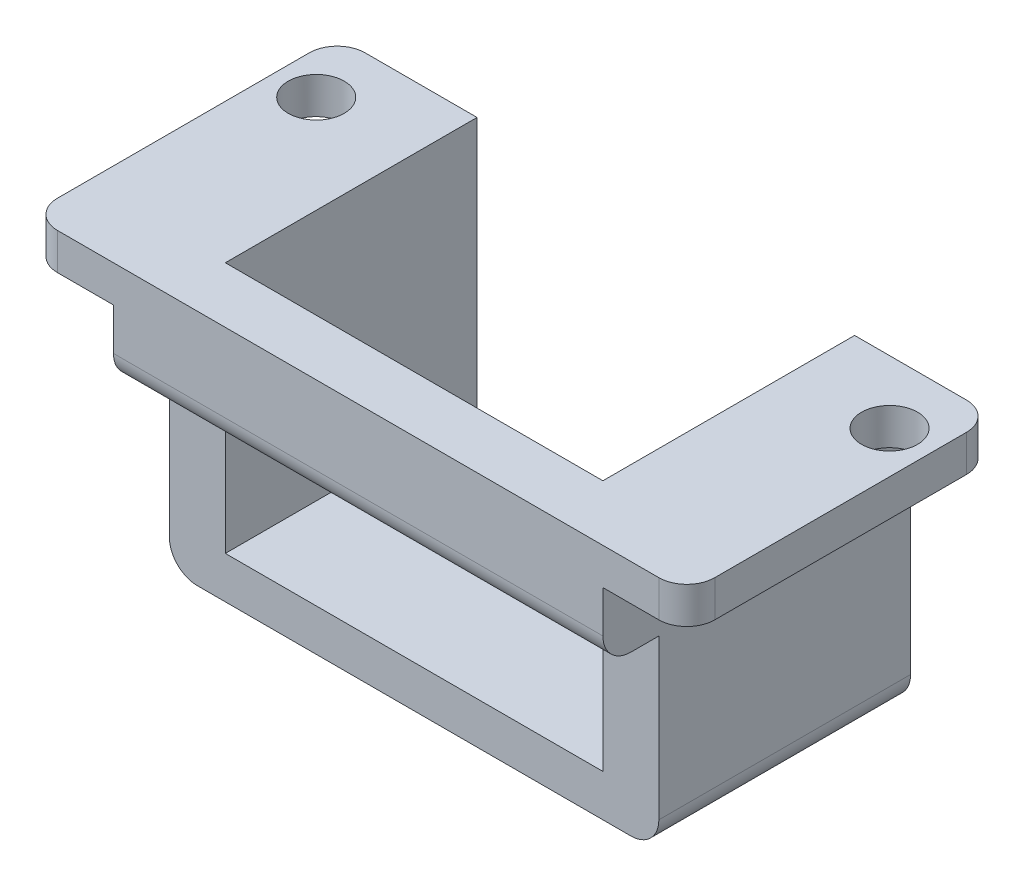
ISO-10303-21;
HEADER;
FILE_DESCRIPTION(('STEP AP214'),'2;1');
FILE_NAME('part.step','',(''),(''),'','','');
FILE_SCHEMA(('AUTOMOTIVE_DESIGN { 1 0 10303 214 1 1 1 1 }'));
ENDSEC;
DATA;
#1=APPLICATION_CONTEXT('core data for automotive mechanical design processes');
#2=APPLICATION_PROTOCOL_DEFINITION('international standard','automotive_design',2000,#1);
#3=PRODUCT_CONTEXT('',#1,'mechanical');
#4=PRODUCT('Part','Part','',(#3));
#5=PRODUCT_RELATED_PRODUCT_CATEGORY('part','',(#4));
#6=PRODUCT_DEFINITION_FORMATION('','',#4);
#7=PRODUCT_DEFINITION_CONTEXT('part definition',#1,'design');
#8=PRODUCT_DEFINITION('design','',#6,#7);
#9=PRODUCT_DEFINITION_SHAPE('','',#8);
#10=(LENGTH_UNIT() NAMED_UNIT(*) SI_UNIT(.MILLI.,.METRE.));
#11=(NAMED_UNIT(*) PLANE_ANGLE_UNIT() SI_UNIT($,.RADIAN.));
#12=(NAMED_UNIT(*) SI_UNIT($,.STERADIAN.) SOLID_ANGLE_UNIT());
#13=UNCERTAINTY_MEASURE_WITH_UNIT(LENGTH_MEASURE(1.E-05),#10,'distance_accuracy_value','');
#14=(GEOMETRIC_REPRESENTATION_CONTEXT(3) GLOBAL_UNCERTAINTY_ASSIGNED_CONTEXT((#13)) GLOBAL_UNIT_ASSIGNED_CONTEXT((#10,
#11,#12)) REPRESENTATION_CONTEXT('',''));
#15=CARTESIAN_POINT('',(0.,0.,0.));
#16=DIRECTION('',(0.,0.,1.));
#17=DIRECTION('',(1.,0.,0.));
#18=AXIS2_PLACEMENT_3D('',#15,#16,#17);
#19=CARTESIAN_POINT('',(47.,-2.61445670320697,9.));
#20=DIRECTION('',(0.,1.,0.));
#21=DIRECTION('',(0.,0.,1.));
#22=AXIS2_PLACEMENT_3D('',#19,#20,#21);
#23=PLANE('',#22);
#24=CARTESIAN_POINT('',(44.,-2.61445670320698,4.5));
#25=DIRECTION('',(0.,1.,0.));
#26=DIRECTION('',(-1.,0.,0.));
#27=AXIS2_PLACEMENT_3D('',#24,#25,#26);
#28=CIRCLE('',#27,2.);
#29=CARTESIAN_POINT('',(42.,-2.61445670320698,4.5));
#30=VERTEX_POINT('',#29);
#31=EDGE_CURVE('E228',#30,#30,#28,.T.);
#32=ORIENTED_EDGE('',*,*,#31,.T.);
#33=EDGE_LOOP('',(#32));
#34=FACE_BOUND('',#33,.T.);
#35=DIRECTION('',(1.,0.,0.));
#36=VECTOR('',#35,1.);
#37=CARTESIAN_POINT('',(0.,-2.61445670320697,22.));
#38=LINE('',#37,#36);
#39=CARTESIAN_POINT('',(41.,-2.61445670320697,22.));
#40=VERTEX_POINT('',#39);
#41=CARTESIAN_POINT('',(45.,-2.61445670320697,22.));
#42=VERTEX_POINT('',#41);
#43=EDGE_CURVE('E363',#40,#42,#38,.T.);
#44=ORIENTED_EDGE('',*,*,#43,.F.);
#45=DIRECTION('',(0.,0.,-1.));
#46=VECTOR('',#45,1.);
#47=CARTESIAN_POINT('',(41.,-2.61445670320697,9.));
#48=LINE('',#47,#46);
#49=CARTESIAN_POINT('',(41.,-2.61445670320697,0.));
#50=VERTEX_POINT('',#49);
#51=EDGE_CURVE('E281',#40,#50,#48,.T.);
#52=ORIENTED_EDGE('',*,*,#51,.T.);
#53=DIRECTION('',(1.,0.,0.));
#54=VECTOR('',#53,1.);
#55=CARTESIAN_POINT('',(47.,-2.61445670320697,0.));
#56=LINE('',#55,#54);
#57=CARTESIAN_POINT('',(45.,-2.61445670320697,0.));
#58=VERTEX_POINT('',#57);
#59=EDGE_CURVE('E246',#50,#58,#56,.T.);
#60=ORIENTED_EDGE('',*,*,#59,.T.);
#61=CARTESIAN_POINT('',(45.,-2.61445670320697,2.));
#62=DIRECTION('',(0.,1.,0.));
#63=DIRECTION('',(0.,0.,1.));
#64=AXIS2_PLACEMENT_3D('',#61,#62,#63);
#65=CIRCLE('',#64,2.);
#66=CARTESIAN_POINT('',(47.,-2.61445670320697,2.));
#67=VERTEX_POINT('',#66);
#68=EDGE_CURVE('E337',#58,#67,#65,.F.);
#69=ORIENTED_EDGE('',*,*,#68,.T.);
#70=DIRECTION('',(0.,0.,-1.));
#71=VECTOR('',#70,1.);
#72=CARTESIAN_POINT('',(47.,-2.61445670320697,9.));
#73=LINE('',#72,#71);
#74=CARTESIAN_POINT('',(47.,-2.61445670320697,20.));
#75=VERTEX_POINT('',#74);
#76=EDGE_CURVE('E278',#75,#67,#73,.T.);
#77=ORIENTED_EDGE('',*,*,#76,.F.);
#78=CARTESIAN_POINT('',(45.,-2.61445670320697,20.));
#79=DIRECTION('',(0.,1.,0.));
#80=DIRECTION('',(0.,0.,1.));
#81=AXIS2_PLACEMENT_3D('',#78,#79,#80);
#82=CIRCLE('',#81,2.);
#83=EDGE_CURVE('E308',#75,#42,#82,.F.);
#84=ORIENTED_EDGE('',*,*,#83,.T.);
#85=EDGE_LOOP('',(#44,#52,#60,#69,#77,#84));
#86=FACE_BOUND('',#85,.T.);
#87=ADVANCED_FACE('F34',(#34,#86),#23,.F.);
#88=CARTESIAN_POINT('',(0.,-2.61445670320698,9.));
#89=DIRECTION('',(1.,0.,0.));
#90=DIRECTION('',(0.,0.,-1.));
#91=AXIS2_PLACEMENT_3D('',#88,#89,#90);
#92=PLANE('',#91);
#93=DIRECTION('',(0.,0.,-1.));
#94=VECTOR('',#93,1.);
#95=CARTESIAN_POINT('',(0.,0.,9.));
#96=LINE('',#95,#94);
#97=CARTESIAN_POINT('',(0.,0.,20.));
#98=VERTEX_POINT('',#97);
#99=CARTESIAN_POINT('',(0.,0.,2.));
#100=VERTEX_POINT('',#99);
#101=EDGE_CURVE('E260',#98,#100,#96,.T.);
#102=ORIENTED_EDGE('',*,*,#101,.T.);
#103=DIRECTION('',(0.,-1.,0.));
#104=VECTOR('',#103,1.);
#105=CARTESIAN_POINT('',(0.,-2.61445670320698,2.));
#106=LINE('',#105,#104);
#107=CARTESIAN_POINT('',(0.,-2.61445670320698,2.));
#108=VERTEX_POINT('',#107);
#109=EDGE_CURVE('E334',#100,#108,#106,.T.);
#110=ORIENTED_EDGE('',*,*,#109,.T.);
#111=DIRECTION('',(0.,0.,-1.));
#112=VECTOR('',#111,1.);
#113=CARTESIAN_POINT('',(0.,-2.61445670320698,9.));
#114=LINE('',#113,#112);
#115=CARTESIAN_POINT('',(0.,-2.61445670320698,20.));
#116=VERTEX_POINT('',#115);
#117=EDGE_CURVE('E287',#116,#108,#114,.T.);
#118=ORIENTED_EDGE('',*,*,#117,.F.);
#119=DIRECTION('',(0.,-1.,0.));
#120=VECTOR('',#119,1.);
#121=CARTESIAN_POINT('',(0.,0.,20.));
#122=LINE('',#121,#120);
#123=EDGE_CURVE('E311',#116,#98,#122,.F.);
#124=ORIENTED_EDGE('',*,*,#123,.T.);
#125=EDGE_LOOP('',(#102,#110,#118,#124));
#126=FACE_BOUND('',#125,.T.);
#127=ADVANCED_FACE('F428',(#126),#92,.F.);
#128=CARTESIAN_POINT('',(6.,-21.,9.));
#129=DIRECTION('',(1.,0.,0.));
#130=DIRECTION('',(0.,0.,-1.));
#131=AXIS2_PLACEMENT_3D('',#128,#129,#130);
#132=PLANE('',#131);
#133=DIRECTION('',(0.,0.,1.));
#134=VECTOR('',#133,1.);
#135=CARTESIAN_POINT('',(6.,-7.61445670320697,0.));
#136=LINE('',#135,#134);
#137=CARTESIAN_POINT('',(6.,-7.61445670320697,18.));
#138=VERTEX_POINT('',#137);
#139=CARTESIAN_POINT('',(6.,-7.61445670320697,20.));
#140=VERTEX_POINT('',#139);
#141=EDGE_CURVE('E204',#138,#140,#136,.T.);
#142=ORIENTED_EDGE('',*,*,#141,.T.);
#143=CARTESIAN_POINT('',(6.,-5.61445670320697,20.));
#144=DIRECTION('',(1.,0.,0.));
#145=DIRECTION('',(0.,0.,-1.));
#146=AXIS2_PLACEMENT_3D('',#143,#144,#145);
#147=CIRCLE('',#146,2.);
#148=CARTESIAN_POINT('',(6.,-5.61445670320697,22.));
#149=VERTEX_POINT('',#148);
#150=EDGE_CURVE('E56',#140,#149,#147,.F.);
#151=ORIENTED_EDGE('',*,*,#150,.T.);
#152=DIRECTION('',(0.,1.,0.));
#153=VECTOR('',#152,1.);
#154=CARTESIAN_POINT('',(6.,-7.61445670320697,22.));
#155=LINE('',#154,#153);
#156=CARTESIAN_POINT('',(6.,-2.61445670320697,22.));
#157=VERTEX_POINT('',#156);
#158=EDGE_CURVE('E351',#149,#157,#155,.T.);
#159=ORIENTED_EDGE('',*,*,#158,.T.);
#160=DIRECTION('',(0.,0.,-1.));
#161=VECTOR('',#160,1.);
#162=CARTESIAN_POINT('',(6.,-2.61445670320698,9.));
#163=LINE('',#162,#161);
#164=CARTESIAN_POINT('',(6.,-2.61445670320698,0.));
#165=VERTEX_POINT('',#164);
#166=EDGE_CURVE('E284',#157,#165,#163,.T.);
#167=ORIENTED_EDGE('',*,*,#166,.T.);
#168=DIRECTION('',(0.,-1.,0.));
#169=VECTOR('',#168,1.);
#170=CARTESIAN_POINT('',(6.,-21.,0.));
#171=LINE('',#170,#169);
#172=CARTESIAN_POINT('',(6.,-19.,0.));
#173=VERTEX_POINT('',#172);
#174=EDGE_CURVE('E238',#165,#173,#171,.T.);
#175=ORIENTED_EDGE('',*,*,#174,.T.);
#176=DIRECTION('',(0.,0.,-1.));
#177=VECTOR('',#176,1.);
#178=CARTESIAN_POINT('',(6.,-19.,9.));
#179=LINE('',#178,#177);
#180=CARTESIAN_POINT('',(6.,-19.,18.));
#181=VERTEX_POINT('',#180);
#182=EDGE_CURVE('E331',#173,#181,#179,.F.);
#183=ORIENTED_EDGE('',*,*,#182,.T.);
#184=DIRECTION('',(0.,-1.,0.));
#185=VECTOR('',#184,1.);
#186=CARTESIAN_POINT('',(6.,-2.61445670320698,18.));
#187=LINE('',#186,#185);
#188=EDGE_CURVE('E217',#138,#181,#187,.T.);
#189=ORIENTED_EDGE('',*,*,#188,.F.);
#190=EDGE_LOOP('',(#142,#151,#159,#167,#175,#183,#189));
#191=FACE_BOUND('',#190,.T.);
#192=ADVANCED_FACE('F350',(#191),#132,.F.);
#193=CARTESIAN_POINT('',(41.,-21.,9.));
#194=DIRECTION('',(0.,1.,0.));
#195=DIRECTION('',(-1.,0.,0.));
#196=AXIS2_PLACEMENT_3D('',#193,#194,#195);
#197=PLANE('',#196);
#198=DIRECTION('',(1.,0.,0.));
#199=VECTOR('',#198,1.);
#200=CARTESIAN_POINT('',(41.,-21.,0.));
#201=LINE('',#200,#199);
#202=CARTESIAN_POINT('',(8.,-21.,0.));
#203=VERTEX_POINT('',#202);
#204=CARTESIAN_POINT('',(39.,-21.,0.));
#205=VERTEX_POINT('',#204);
#206=EDGE_CURVE('E241',#203,#205,#201,.T.);
#207=ORIENTED_EDGE('',*,*,#206,.T.);
#208=DIRECTION('',(0.,0.,-1.));
#209=VECTOR('',#208,1.);
#210=CARTESIAN_POINT('',(39.,-21.,9.));
#211=LINE('',#210,#209);
#212=CARTESIAN_POINT('',(39.,-21.,18.));
#213=VERTEX_POINT('',#212);
#214=EDGE_CURVE('E326',#205,#213,#211,.F.);
#215=ORIENTED_EDGE('',*,*,#214,.T.);
#216=DIRECTION('',(1.,0.,0.));
#217=VECTOR('',#216,1.);
#218=CARTESIAN_POINT('',(6.,-21.,18.));
#219=LINE('',#218,#217);
#220=CARTESIAN_POINT('',(8.,-21.,18.));
#221=VERTEX_POINT('',#220);
#222=EDGE_CURVE('E213',#221,#213,#219,.T.);
#223=ORIENTED_EDGE('',*,*,#222,.F.);
#224=DIRECTION('',(0.,0.,-1.));
#225=VECTOR('',#224,1.);
#226=CARTESIAN_POINT('',(8.,-21.,9.));
#227=LINE('',#226,#225);
#228=EDGE_CURVE('E323',#221,#203,#227,.T.);
#229=ORIENTED_EDGE('',*,*,#228,.T.);
#230=EDGE_LOOP('',(#207,#215,#223,#229));
#231=FACE_BOUND('',#230,.T.);
#232=ADVANCED_FACE('F376',(#231),#197,.F.);
#233=CARTESIAN_POINT('',(41.,-2.61445670320697,9.));
#234=DIRECTION('',(-1.,0.,0.));
#235=DIRECTION('',(0.,0.,1.));
#236=AXIS2_PLACEMENT_3D('',#233,#234,#235);
#237=PLANE('',#236);
#238=DIRECTION('',(0.,1.,0.));
#239=VECTOR('',#238,1.);
#240=CARTESIAN_POINT('',(41.,-7.61445670320697,22.));
#241=LINE('',#240,#239);
#242=CARTESIAN_POINT('',(41.,-5.61445670320697,22.));
#243=VERTEX_POINT('',#242);
#244=EDGE_CURVE('E353',#243,#40,#241,.T.);
#245=ORIENTED_EDGE('',*,*,#244,.F.);
#246=CARTESIAN_POINT('',(41.,-5.61445670320697,20.));
#247=DIRECTION('',(-1.,0.,0.));
#248=DIRECTION('',(0.,0.,1.));
#249=AXIS2_PLACEMENT_3D('',#246,#247,#248);
#250=CIRCLE('',#249,2.);
#251=CARTESIAN_POINT('',(41.,-7.61445670320697,20.));
#252=VERTEX_POINT('',#251);
#253=EDGE_CURVE('E11',#243,#252,#250,.F.);
#254=ORIENTED_EDGE('',*,*,#253,.T.);
#255=DIRECTION('',(0.,0.,1.));
#256=VECTOR('',#255,1.);
#257=CARTESIAN_POINT('',(41.,-7.61445670320697,0.));
#258=LINE('',#257,#256);
#259=CARTESIAN_POINT('',(41.,-7.61445670320697,18.));
#260=VERTEX_POINT('',#259);
#261=EDGE_CURVE('E186',#260,#252,#258,.T.);
#262=ORIENTED_EDGE('',*,*,#261,.F.);
#263=DIRECTION('',(0.,1.,0.));
#264=VECTOR('',#263,1.);
#265=CARTESIAN_POINT('',(41.,-21.,18.));
#266=LINE('',#265,#264);
#267=CARTESIAN_POINT('',(41.,-19.,18.));
#268=VERTEX_POINT('',#267);
#269=EDGE_CURVE('E201',#268,#260,#266,.T.);
#270=ORIENTED_EDGE('',*,*,#269,.F.);
#271=DIRECTION('',(0.,0.,-1.));
#272=VECTOR('',#271,1.);
#273=CARTESIAN_POINT('',(41.,-19.,9.));
#274=LINE('',#273,#272);
#275=CARTESIAN_POINT('',(41.,-19.,0.));
#276=VERTEX_POINT('',#275);
#277=EDGE_CURVE('E313',#268,#276,#274,.T.);
#278=ORIENTED_EDGE('',*,*,#277,.T.);
#279=DIRECTION('',(0.,1.,0.));
#280=VECTOR('',#279,1.);
#281=CARTESIAN_POINT('',(41.,-2.61445670320697,0.));
#282=LINE('',#281,#280);
#283=EDGE_CURVE('E244',#276,#50,#282,.T.);
#284=ORIENTED_EDGE('',*,*,#283,.T.);
#285=ORIENTED_EDGE('',*,*,#51,.F.);
#286=EDGE_LOOP('',(#245,#254,#262,#270,#278,#284,#285));
#287=FACE_BOUND('',#286,.T.);
#288=ADVANCED_FACE('F199',(#287),#237,.F.);
#289=ORIENTED_EDGE('',*,*,#166,.F.);
#290=CARTESIAN_POINT('',(2.,-2.61445670320697,22.));
#291=VERTEX_POINT('',#290);
#292=EDGE_CURVE('E359',#291,#157,#38,.T.);
#293=ORIENTED_EDGE('',*,*,#292,.F.);
#294=CARTESIAN_POINT('',(2.,-2.61445670320697,20.));
#295=DIRECTION('',(0.,1.,0.));
#296=DIRECTION('',(0.,0.,1.));
#297=AXIS2_PLACEMENT_3D('',#294,#295,#296);
#298=CIRCLE('',#297,2.);
#299=EDGE_CURVE('E306',#291,#116,#298,.F.);
#300=ORIENTED_EDGE('',*,*,#299,.T.);
#301=ORIENTED_EDGE('',*,*,#117,.T.);
#302=CARTESIAN_POINT('',(2.,-2.61445670320697,2.));
#303=DIRECTION('',(0.,1.,0.));
#304=DIRECTION('',(0.,0.,1.));
#305=AXIS2_PLACEMENT_3D('',#302,#303,#304);
#306=CIRCLE('',#305,2.);
#307=CARTESIAN_POINT('',(2.,-2.61445670320698,0.));
#308=VERTEX_POINT('',#307);
#309=EDGE_CURVE('E339',#108,#308,#306,.F.);
#310=ORIENTED_EDGE('',*,*,#309,.T.);
#311=DIRECTION('',(1.,0.,0.));
#312=VECTOR('',#311,1.);
#313=CARTESIAN_POINT('',(6.,-2.61445670320698,0.));
#314=LINE('',#313,#312);
#315=EDGE_CURVE('E236',#308,#165,#314,.T.);
#316=ORIENTED_EDGE('',*,*,#315,.T.);
#317=EDGE_LOOP('',(#289,#293,#300,#301,#310,#316));
#318=FACE_BOUND('',#317,.T.);
#319=CARTESIAN_POINT('',(3.,-2.61445670320698,4.5));
#320=DIRECTION('',(0.,-1.,0.));
#321=DIRECTION('',(1.,0.,0.));
#322=AXIS2_PLACEMENT_3D('',#319,#320,#321);
#323=CIRCLE('',#322,2.);
#324=CARTESIAN_POINT('',(5.,-2.61445670320698,4.5));
#325=VERTEX_POINT('',#324);
#326=EDGE_CURVE('E232',#325,#325,#323,.T.);
#327=ORIENTED_EDGE('',*,*,#326,.F.);
#328=EDGE_LOOP('',(#327));
#329=FACE_BOUND('',#328,.T.);
#330=ADVANCED_FACE('F417',(#318,#329),#23,.F.);
#331=CARTESIAN_POINT('',(47.,0.,9.));
#332=DIRECTION('',(-1.,0.,0.));
#333=DIRECTION('',(0.,0.,1.));
#334=AXIS2_PLACEMENT_3D('',#331,#332,#333);
#335=PLANE('',#334);
#336=ORIENTED_EDGE('',*,*,#76,.T.);
#337=DIRECTION('',(0.,1.,0.));
#338=VECTOR('',#337,1.);
#339=CARTESIAN_POINT('',(47.,0.,2.));
#340=LINE('',#339,#338);
#341=CARTESIAN_POINT('',(47.,0.,2.));
#342=VERTEX_POINT('',#341);
#343=EDGE_CURVE('E195',#67,#342,#340,.T.);
#344=ORIENTED_EDGE('',*,*,#343,.T.);
#345=DIRECTION('',(0.,0.,-1.));
#346=VECTOR('',#345,1.);
#347=CARTESIAN_POINT('',(47.,0.,9.));
#348=LINE('',#347,#346);
#349=CARTESIAN_POINT('',(47.,0.,20.));
#350=VERTEX_POINT('',#349);
#351=EDGE_CURVE('E275',#350,#342,#348,.T.);
#352=ORIENTED_EDGE('',*,*,#351,.F.);
#353=DIRECTION('',(0.,1.,0.));
#354=VECTOR('',#353,1.);
#355=CARTESIAN_POINT('',(47.,-2.61445670320697,20.));
#356=LINE('',#355,#354);
#357=EDGE_CURVE('E304',#350,#75,#356,.F.);
#358=ORIENTED_EDGE('',*,*,#357,.T.);
#359=EDGE_LOOP('',(#336,#344,#352,#358));
#360=FACE_BOUND('',#359,.T.);
#361=ADVANCED_FACE('F397',(#360),#335,.F.);
#362=CARTESIAN_POINT('',(37.,-18.,9.));
#363=DIRECTION('',(1.,0.,0.));
#364=DIRECTION('',(0.,0.,-1.));
#365=AXIS2_PLACEMENT_3D('',#362,#363,#364);
#366=PLANE('',#365);
#367=DIRECTION('',(0.,-1.,0.));
#368=VECTOR('',#367,1.);
#369=CARTESIAN_POINT('',(37.,-18.,0.));
#370=LINE('',#369,#368);
#371=CARTESIAN_POINT('',(37.,0.,0.));
#372=VERTEX_POINT('',#371);
#373=CARTESIAN_POINT('',(37.,-18.,0.));
#374=VERTEX_POINT('',#373);
#375=EDGE_CURVE('E251',#372,#374,#370,.T.);
#376=ORIENTED_EDGE('',*,*,#375,.T.);
#377=DIRECTION('',(0.,0.,-1.));
#378=VECTOR('',#377,1.);
#379=CARTESIAN_POINT('',(37.,-18.,9.));
#380=LINE('',#379,#378);
#381=CARTESIAN_POINT('',(37.,-18.,18.));
#382=VERTEX_POINT('',#381);
#383=EDGE_CURVE('E269',#382,#374,#380,.T.);
#384=ORIENTED_EDGE('',*,*,#383,.F.);
#385=DIRECTION('',(0.,-1.,0.));
#386=VECTOR('',#385,1.);
#387=CARTESIAN_POINT('',(37.,0.,18.));
#388=LINE('',#387,#386);
#389=CARTESIAN_POINT('',(37.,-7.61445670320697,18.));
#390=VERTEX_POINT('',#389);
#391=EDGE_CURVE('E212',#390,#382,#388,.T.);
#392=ORIENTED_EDGE('',*,*,#391,.F.);
#393=CARTESIAN_POINT('',(37.,0.,18.));
#394=VERTEX_POINT('',#393);
#395=EDGE_CURVE('E215',#394,#390,#388,.T.);
#396=ORIENTED_EDGE('',*,*,#395,.F.);
#397=DIRECTION('',(0.,0.,-1.));
#398=VECTOR('',#397,1.);
#399=CARTESIAN_POINT('',(37.,0.,9.));
#400=LINE('',#399,#398);
#401=EDGE_CURVE('E272',#394,#372,#400,.T.);
#402=ORIENTED_EDGE('',*,*,#401,.T.);
#403=EDGE_LOOP('',(#376,#384,#392,#396,#402));
#404=FACE_BOUND('',#403,.T.);
#405=ADVANCED_FACE('F486',(#404),#366,.F.);
#406=CARTESIAN_POINT('',(10.,-18.,9.));
#407=DIRECTION('',(0.,-1.,0.));
#408=DIRECTION('',(0.,0.,-1.));
#409=AXIS2_PLACEMENT_3D('',#406,#407,#408);
#410=PLANE('',#409);
#411=DIRECTION('',(-1.,0.,0.));
#412=VECTOR('',#411,1.);
#413=CARTESIAN_POINT('',(10.,-18.,0.));
#414=LINE('',#413,#412);
#415=CARTESIAN_POINT('',(10.,-18.,0.));
#416=VERTEX_POINT('',#415);
#417=EDGE_CURVE('E253',#374,#416,#414,.T.);
#418=ORIENTED_EDGE('',*,*,#417,.T.);
#419=DIRECTION('',(0.,0.,-1.));
#420=VECTOR('',#419,1.);
#421=CARTESIAN_POINT('',(10.,-18.,9.));
#422=LINE('',#421,#420);
#423=CARTESIAN_POINT('',(10.,-18.,18.));
#424=VERTEX_POINT('',#423);
#425=EDGE_CURVE('E266',#424,#416,#422,.T.);
#426=ORIENTED_EDGE('',*,*,#425,.F.);
#427=DIRECTION('',(-1.,0.,0.));
#428=VECTOR('',#427,1.);
#429=CARTESIAN_POINT('',(37.,-18.,18.));
#430=LINE('',#429,#428);
#431=EDGE_CURVE('E221',#382,#424,#430,.T.);
#432=ORIENTED_EDGE('',*,*,#431,.F.);
#433=ORIENTED_EDGE('',*,*,#383,.T.);
#434=EDGE_LOOP('',(#418,#426,#432,#433));
#435=FACE_BOUND('',#434,.T.);
#436=ADVANCED_FACE('F482',(#435),#410,.F.);
#437=CARTESIAN_POINT('',(10.,0.,9.));
#438=DIRECTION('',(-1.,0.,0.));
#439=DIRECTION('',(0.,-1.,0.));
#440=AXIS2_PLACEMENT_3D('',#437,#438,#439);
#441=PLANE('',#440);
#442=DIRECTION('',(0.,1.,0.));
#443=VECTOR('',#442,1.);
#444=CARTESIAN_POINT('',(10.,0.,0.));
#445=LINE('',#444,#443);
#446=CARTESIAN_POINT('',(10.,0.,0.));
#447=VERTEX_POINT('',#446);
#448=EDGE_CURVE('E255',#416,#447,#445,.T.);
#449=ORIENTED_EDGE('',*,*,#448,.T.);
#450=DIRECTION('',(0.,0.,-1.));
#451=VECTOR('',#450,1.);
#452=CARTESIAN_POINT('',(10.,0.,9.));
#453=LINE('',#452,#451);
#454=CARTESIAN_POINT('',(10.,0.,18.));
#455=VERTEX_POINT('',#454);
#456=EDGE_CURVE('E263',#455,#447,#453,.T.);
#457=ORIENTED_EDGE('',*,*,#456,.F.);
#458=DIRECTION('',(0.,1.,0.));
#459=VECTOR('',#458,1.);
#460=CARTESIAN_POINT('',(10.,-18.,18.));
#461=LINE('',#460,#459);
#462=CARTESIAN_POINT('',(10.,-7.61445670320697,18.));
#463=VERTEX_POINT('',#462);
#464=EDGE_CURVE('E224',#463,#455,#461,.T.);
#465=ORIENTED_EDGE('',*,*,#464,.F.);
#466=EDGE_CURVE('E225',#424,#463,#461,.T.);
#467=ORIENTED_EDGE('',*,*,#466,.F.);
#468=ORIENTED_EDGE('',*,*,#425,.T.);
#469=EDGE_LOOP('',(#449,#457,#465,#467,#468));
#470=FACE_BOUND('',#469,.T.);
#471=ADVANCED_FACE('F478',(#470),#441,.F.);
#472=CARTESIAN_POINT('',(0.,0.,9.));
#473=DIRECTION('',(0.,-1.,0.));
#474=DIRECTION('',(0.,0.,-1.));
#475=AXIS2_PLACEMENT_3D('',#472,#473,#474);
#476=PLANE('',#475);
#477=CARTESIAN_POINT('',(3.,0.,4.5));
#478=DIRECTION('',(0.,-1.,0.));
#479=DIRECTION('',(0.,0.,-1.));
#480=AXIS2_PLACEMENT_3D('',#477,#478,#479);
#481=CIRCLE('',#480,2.);
#482=CARTESIAN_POINT('',(3.,0.,2.5));
#483=VERTEX_POINT('',#482);
#484=EDGE_CURVE('E235',#483,#483,#481,.T.);
#485=ORIENTED_EDGE('',*,*,#484,.T.);
#486=EDGE_LOOP('',(#485));
#487=FACE_BOUND('',#486,.T.);
#488=DIRECTION('',(-1.,0.,0.));
#489=VECTOR('',#488,1.);
#490=CARTESIAN_POINT('',(0.,0.,0.));
#491=LINE('',#490,#489);
#492=CARTESIAN_POINT('',(2.,0.,0.));
#493=VERTEX_POINT('',#492);
#494=EDGE_CURVE('E257',#447,#493,#491,.T.);
#495=ORIENTED_EDGE('',*,*,#494,.T.);
#496=CARTESIAN_POINT('',(2.,0.,2.));
#497=DIRECTION('',(0.,-1.,0.));
#498=DIRECTION('',(0.,0.,-1.));
#499=AXIS2_PLACEMENT_3D('',#496,#497,#498);
#500=CIRCLE('',#499,2.);
#501=EDGE_CURVE('E343',#493,#100,#500,.F.);
#502=ORIENTED_EDGE('',*,*,#501,.T.);
#503=ORIENTED_EDGE('',*,*,#101,.F.);
#504=CARTESIAN_POINT('',(2.,0.,20.));
#505=DIRECTION('',(0.,-1.,0.));
#506=DIRECTION('',(0.,0.,-1.));
#507=AXIS2_PLACEMENT_3D('',#504,#505,#506);
#508=CIRCLE('',#507,2.);
#509=CARTESIAN_POINT('',(2.,0.,22.));
#510=VERTEX_POINT('',#509);
#511=EDGE_CURVE('E300',#98,#510,#508,.F.);
#512=ORIENTED_EDGE('',*,*,#511,.T.);
#513=DIRECTION('',(-1.,0.,0.));
#514=VECTOR('',#513,1.);
#515=CARTESIAN_POINT('',(0.,0.,22.));
#516=LINE('',#515,#514);
#517=CARTESIAN_POINT('',(45.,0.,22.));
#518=VERTEX_POINT('',#517);
#519=EDGE_CURVE('E362',#518,#510,#516,.T.);
#520=ORIENTED_EDGE('',*,*,#519,.F.);
#521=CARTESIAN_POINT('',(45.,0.,20.));
#522=DIRECTION('',(0.,-1.,0.));
#523=DIRECTION('',(0.,0.,-1.));
#524=AXIS2_PLACEMENT_3D('',#521,#522,#523);
#525=CIRCLE('',#524,2.);
#526=EDGE_CURVE('E302',#518,#350,#525,.F.);
#527=ORIENTED_EDGE('',*,*,#526,.T.);
#528=ORIENTED_EDGE('',*,*,#351,.T.);
#529=CARTESIAN_POINT('',(45.,0.,2.));
#530=DIRECTION('',(0.,-1.,0.));
#531=DIRECTION('',(0.,0.,-1.));
#532=AXIS2_PLACEMENT_3D('',#529,#530,#531);
#533=CIRCLE('',#532,2.);
#534=CARTESIAN_POINT('',(45.,0.,0.));
#535=VERTEX_POINT('',#534);
#536=EDGE_CURVE('E341',#342,#535,#533,.F.);
#537=ORIENTED_EDGE('',*,*,#536,.T.);
#538=DIRECTION('',(-1.,0.,0.));
#539=VECTOR('',#538,1.);
#540=CARTESIAN_POINT('',(37.,0.,0.));
#541=LINE('',#540,#539);
#542=EDGE_CURVE('E249',#535,#372,#541,.T.);
#543=ORIENTED_EDGE('',*,*,#542,.T.);
#544=ORIENTED_EDGE('',*,*,#401,.F.);
#545=DIRECTION('',(-1.,0.,0.));
#546=VECTOR('',#545,1.);
#547=CARTESIAN_POINT('',(0.,0.,18.));
#548=LINE('',#547,#546);
#549=EDGE_CURVE('E358',#394,#455,#548,.T.);
#550=ORIENTED_EDGE('',*,*,#549,.T.);
#551=ORIENTED_EDGE('',*,*,#456,.T.);
#552=EDGE_LOOP('',(#495,#502,#503,#512,#520,#527,#528,#537,#543,#544,#550,#551));
#553=FACE_BOUND('',#552,.T.);
#554=CARTESIAN_POINT('',(44.,0.,4.5));
#555=DIRECTION('',(0.,-1.,0.));
#556=DIRECTION('',(0.,0.,-1.));
#557=AXIS2_PLACEMENT_3D('',#554,#555,#556);
#558=CIRCLE('',#557,2.);
#559=CARTESIAN_POINT('',(44.,0.,2.5));
#560=VERTEX_POINT('',#559);
#561=EDGE_CURVE('E231',#560,#560,#558,.F.);
#562=ORIENTED_EDGE('',*,*,#561,.F.);
#563=EDGE_LOOP('',(#562));
#564=FACE_BOUND('',#563,.T.);
#565=ADVANCED_FACE('F407',(#487,#553,#564),#476,.F.);
#566=CARTESIAN_POINT('',(0.,0.,0.));
#567=DIRECTION('',(0.,0.,-1.));
#568=DIRECTION('',(-1.,0.,0.));
#569=AXIS2_PLACEMENT_3D('',#566,#567,#568);
#570=PLANE('',#569);
#571=ORIENTED_EDGE('',*,*,#283,.F.);
#572=CARTESIAN_POINT('',(39.,-19.,0.));
#573=DIRECTION('',(0.,0.,-1.));
#574=DIRECTION('',(-1.,0.,0.));
#575=AXIS2_PLACEMENT_3D('',#572,#573,#574);
#576=CIRCLE('',#575,2.);
#577=EDGE_CURVE('E321',#276,#205,#576,.T.);
#578=ORIENTED_EDGE('',*,*,#577,.T.);
#579=ORIENTED_EDGE('',*,*,#206,.F.);
#580=CARTESIAN_POINT('',(8.,-19.,0.));
#581=DIRECTION('',(0.,0.,-1.));
#582=DIRECTION('',(-1.,0.,0.));
#583=AXIS2_PLACEMENT_3D('',#580,#581,#582);
#584=CIRCLE('',#583,2.);
#585=EDGE_CURVE('E319',#203,#173,#584,.T.);
#586=ORIENTED_EDGE('',*,*,#585,.T.);
#587=ORIENTED_EDGE('',*,*,#174,.F.);
#588=ORIENTED_EDGE('',*,*,#315,.F.);
#589=DIRECTION('',(0.,-1.,0.));
#590=VECTOR('',#589,1.);
#591=CARTESIAN_POINT('',(2.,0.,0.));
#592=LINE('',#591,#590);
#593=EDGE_CURVE('E317',#308,#493,#592,.F.);
#594=ORIENTED_EDGE('',*,*,#593,.T.);
#595=ORIENTED_EDGE('',*,*,#494,.F.);
#596=ORIENTED_EDGE('',*,*,#448,.F.);
#597=ORIENTED_EDGE('',*,*,#417,.F.);
#598=ORIENTED_EDGE('',*,*,#375,.F.);
#599=ORIENTED_EDGE('',*,*,#542,.F.);
#600=DIRECTION('',(0.,1.,0.));
#601=VECTOR('',#600,1.);
#602=CARTESIAN_POINT('',(45.,-2.61445670320697,0.));
#603=LINE('',#602,#601);
#604=EDGE_CURVE('E315',#535,#58,#603,.F.);
#605=ORIENTED_EDGE('',*,*,#604,.T.);
#606=ORIENTED_EDGE('',*,*,#59,.F.);
#607=EDGE_LOOP('',(#571,#578,#579,#586,#587,#588,#594,#595,#596,#597,#598,#599,#605,#606));
#608=FACE_BOUND('',#607,.T.);
#609=ADVANCED_FACE('F380',(#608),#570,.T.);
#610=CARTESIAN_POINT('',(3.,6.38554329679302,4.5));
#611=DIRECTION('',(0.,-1.,0.));
#612=DIRECTION('',(1.,0.,0.));
#613=AXIS2_PLACEMENT_3D('',#610,#611,#612);
#614=CYLINDRICAL_SURFACE('',#613,2.);
#615=ORIENTED_EDGE('',*,*,#326,.T.);
#616=EDGE_LOOP('',(#615));
#617=FACE_BOUND('',#616,.T.);
#618=ORIENTED_EDGE('',*,*,#484,.F.);
#619=EDGE_LOOP('',(#618));
#620=FACE_BOUND('',#619,.T.);
#621=ADVANCED_FACE('F469',(#617,#620),#614,.F.);
#622=CARTESIAN_POINT('',(44.,6.38554329679302,4.5));
#623=DIRECTION('',(0.,-1.,0.));
#624=DIRECTION('',(1.,0.,0.));
#625=AXIS2_PLACEMENT_3D('',#622,#623,#624);
#626=CYLINDRICAL_SURFACE('',#625,2.);
#627=ORIENTED_EDGE('',*,*,#31,.F.);
#628=EDGE_LOOP('',(#627));
#629=FACE_BOUND('',#628,.T.);
#630=ORIENTED_EDGE('',*,*,#561,.T.);
#631=EDGE_LOOP('',(#630));
#632=FACE_BOUND('',#631,.T.);
#633=ADVANCED_FACE('F466',(#629,#632),#626,.F.);
#634=CARTESIAN_POINT('',(0.,0.,18.));
#635=DIRECTION('',(0.,0.,1.));
#636=DIRECTION('',(1.,0.,0.));
#637=AXIS2_PLACEMENT_3D('',#634,#635,#636);
#638=PLANE('',#637);
#639=DIRECTION('',(1.,0.,0.));
#640=VECTOR('',#639,1.);
#641=CARTESIAN_POINT('',(0.,-7.61445670320697,18.));
#642=LINE('',#641,#640);
#643=EDGE_CURVE('E205',#138,#463,#642,.T.);
#644=ORIENTED_EDGE('',*,*,#643,.F.);
#645=ORIENTED_EDGE('',*,*,#188,.T.);
#646=CARTESIAN_POINT('',(8.,-19.,18.));
#647=DIRECTION('',(0.,0.,1.));
#648=DIRECTION('',(1.,0.,0.));
#649=AXIS2_PLACEMENT_3D('',#646,#647,#648);
#650=CIRCLE('',#649,2.);
#651=EDGE_CURVE('E328',#181,#221,#650,.T.);
#652=ORIENTED_EDGE('',*,*,#651,.T.);
#653=ORIENTED_EDGE('',*,*,#222,.T.);
#654=CARTESIAN_POINT('',(39.,-19.,18.));
#655=DIRECTION('',(0.,0.,1.));
#656=DIRECTION('',(1.,0.,0.));
#657=AXIS2_PLACEMENT_3D('',#654,#655,#656);
#658=CIRCLE('',#657,2.);
#659=EDGE_CURVE('E211',#213,#268,#658,.T.);
#660=ORIENTED_EDGE('',*,*,#659,.T.);
#661=ORIENTED_EDGE('',*,*,#269,.T.);
#662=DIRECTION('',(1.,0.,0.));
#663=VECTOR('',#662,1.);
#664=CARTESIAN_POINT('',(0.,-7.61445670320697,18.));
#665=LINE('',#664,#663);
#666=EDGE_CURVE('E182',#390,#260,#665,.T.);
#667=ORIENTED_EDGE('',*,*,#666,.F.);
#668=ORIENTED_EDGE('',*,*,#391,.T.);
#669=ORIENTED_EDGE('',*,*,#431,.T.);
#670=ORIENTED_EDGE('',*,*,#466,.T.);
#671=EDGE_LOOP('',(#644,#645,#652,#653,#660,#661,#667,#668,#669,#670));
#672=FACE_BOUND('',#671,.T.);
#673=ADVANCED_FACE('F208',(#672),#638,.T.);
#674=CARTESIAN_POINT('',(0.,0.,18.));
#675=DIRECTION('',(0.,0.,1.));
#676=DIRECTION('',(1.,0.,0.));
#677=AXIS2_PLACEMENT_3D('',#674,#675,#676);
#678=PLANE('',#677);
#679=ORIENTED_EDGE('',*,*,#549,.F.);
#680=ORIENTED_EDGE('',*,*,#395,.T.);
#681=EDGE_CURVE('E190',#463,#390,#642,.T.);
#682=ORIENTED_EDGE('',*,*,#681,.F.);
#683=ORIENTED_EDGE('',*,*,#464,.T.);
#684=EDGE_LOOP('',(#679,#680,#682,#683));
#685=FACE_BOUND('',#684,.T.);
#686=ADVANCED_FACE('F460',(#685),#678,.F.);
#687=CARTESIAN_POINT('',(0.,0.,22.));
#688=DIRECTION('',(0.,0.,1.));
#689=DIRECTION('',(1.,0.,0.));
#690=AXIS2_PLACEMENT_3D('',#687,#688,#689);
#691=PLANE('',#690);
#692=ORIENTED_EDGE('',*,*,#158,.F.);
#693=DIRECTION('',(-1.,0.,0.));
#694=VECTOR('',#693,1.);
#695=CARTESIAN_POINT('',(0.,-5.61445670320697,22.));
#696=LINE('',#695,#694);
#697=EDGE_CURVE('E42',#149,#243,#696,.F.);
#698=ORIENTED_EDGE('',*,*,#697,.T.);
#699=ORIENTED_EDGE('',*,*,#244,.T.);
#700=ORIENTED_EDGE('',*,*,#43,.T.);
#701=DIRECTION('',(0.,1.,0.));
#702=VECTOR('',#701,1.);
#703=CARTESIAN_POINT('',(45.,0.,22.));
#704=LINE('',#703,#702);
#705=EDGE_CURVE('E297',#42,#518,#704,.T.);
#706=ORIENTED_EDGE('',*,*,#705,.T.);
#707=ORIENTED_EDGE('',*,*,#519,.T.);
#708=DIRECTION('',(0.,-1.,0.));
#709=VECTOR('',#708,1.);
#710=CARTESIAN_POINT('',(2.,-2.61445670320697,22.));
#711=LINE('',#710,#709);
#712=EDGE_CURVE('E290',#510,#291,#711,.T.);
#713=ORIENTED_EDGE('',*,*,#712,.T.);
#714=ORIENTED_EDGE('',*,*,#292,.T.);
#715=EDGE_LOOP('',(#692,#698,#699,#700,#706,#707,#713,#714));
#716=FACE_BOUND('',#715,.T.);
#717=ADVANCED_FACE('F404',(#716),#691,.T.);
#718=CARTESIAN_POINT('',(45.,0.,20.));
#719=DIRECTION('',(0.,-1.,0.));
#720=DIRECTION('',(0.,0.,-1.));
#721=AXIS2_PLACEMENT_3D('',#718,#719,#720);
#722=CYLINDRICAL_SURFACE('',#721,2.);
#723=ORIENTED_EDGE('',*,*,#83,.F.);
#724=ORIENTED_EDGE('',*,*,#357,.F.);
#725=ORIENTED_EDGE('',*,*,#526,.F.);
#726=ORIENTED_EDGE('',*,*,#705,.F.);
#727=EDGE_LOOP('',(#723,#724,#725,#726));
#728=FACE_BOUND('',#727,.T.);
#729=ADVANCED_FACE('F401',(#728),#722,.T.);
#730=CARTESIAN_POINT('',(2.,0.,20.));
#731=DIRECTION('',(0.,1.,0.));
#732=DIRECTION('',(0.,0.,1.));
#733=AXIS2_PLACEMENT_3D('',#730,#731,#732);
#734=CYLINDRICAL_SURFACE('',#733,2.);
#735=ORIENTED_EDGE('',*,*,#511,.F.);
#736=ORIENTED_EDGE('',*,*,#123,.F.);
#737=ORIENTED_EDGE('',*,*,#299,.F.);
#738=ORIENTED_EDGE('',*,*,#712,.F.);
#739=EDGE_LOOP('',(#735,#736,#737,#738));
#740=FACE_BOUND('',#739,.T.);
#741=ADVANCED_FACE('F413',(#740),#734,.T.);
#742=CARTESIAN_POINT('',(39.,-19.,9.));
#743=DIRECTION('',(0.,0.,-1.));
#744=DIRECTION('',(-1.,0.,0.));
#745=AXIS2_PLACEMENT_3D('',#742,#743,#744);
#746=CYLINDRICAL_SURFACE('',#745,2.);
#747=ORIENTED_EDGE('',*,*,#659,.F.);
#748=ORIENTED_EDGE('',*,*,#214,.F.);
#749=ORIENTED_EDGE('',*,*,#577,.F.);
#750=ORIENTED_EDGE('',*,*,#277,.F.);
#751=EDGE_LOOP('',(#747,#748,#749,#750));
#752=FACE_BOUND('',#751,.T.);
#753=ADVANCED_FACE('F383',(#752),#746,.T.);
#754=CARTESIAN_POINT('',(8.,-19.,9.));
#755=DIRECTION('',(0.,0.,-1.));
#756=DIRECTION('',(-1.,0.,0.));
#757=AXIS2_PLACEMENT_3D('',#754,#755,#756);
#758=CYLINDRICAL_SURFACE('',#757,2.);
#759=ORIENTED_EDGE('',*,*,#651,.F.);
#760=ORIENTED_EDGE('',*,*,#182,.F.);
#761=ORIENTED_EDGE('',*,*,#585,.F.);
#762=ORIENTED_EDGE('',*,*,#228,.F.);
#763=EDGE_LOOP('',(#759,#760,#761,#762));
#764=FACE_BOUND('',#763,.T.);
#765=ADVANCED_FACE('F373',(#764),#758,.T.);
#766=CARTESIAN_POINT('',(2.,-2.61445670320698,2.));
#767=DIRECTION('',(0.,1.,0.));
#768=DIRECTION('',(0.,0.,1.));
#769=AXIS2_PLACEMENT_3D('',#766,#767,#768);
#770=CYLINDRICAL_SURFACE('',#769,2.);
#771=ORIENTED_EDGE('',*,*,#501,.F.);
#772=ORIENTED_EDGE('',*,*,#593,.F.);
#773=ORIENTED_EDGE('',*,*,#309,.F.);
#774=ORIENTED_EDGE('',*,*,#109,.F.);
#775=EDGE_LOOP('',(#771,#772,#773,#774));
#776=FACE_BOUND('',#775,.T.);
#777=ADVANCED_FACE('F425',(#776),#770,.T.);
#778=CARTESIAN_POINT('',(45.,0.,2.));
#779=DIRECTION('',(0.,-1.,0.));
#780=DIRECTION('',(0.,0.,-1.));
#781=AXIS2_PLACEMENT_3D('',#778,#779,#780);
#782=CYLINDRICAL_SURFACE('',#781,2.);
#783=ORIENTED_EDGE('',*,*,#68,.F.);
#784=ORIENTED_EDGE('',*,*,#604,.F.);
#785=ORIENTED_EDGE('',*,*,#536,.F.);
#786=ORIENTED_EDGE('',*,*,#343,.F.);
#787=EDGE_LOOP('',(#783,#784,#785,#786));
#788=FACE_BOUND('',#787,.T.);
#789=ADVANCED_FACE('F392',(#788),#782,.T.);
#790=CARTESIAN_POINT('',(0.,-7.61445670320697,0.));
#791=DIRECTION('',(0.,-1.,0.));
#792=DIRECTION('',(1.,0.,0.));
#793=AXIS2_PLACEMENT_3D('',#790,#791,#792);
#794=PLANE('',#793);
#795=ORIENTED_EDGE('',*,*,#261,.T.);
#796=DIRECTION('',(-1.,0.,0.));
#797=VECTOR('',#796,1.);
#798=CARTESIAN_POINT('',(0.,-7.61445670320697,20.));
#799=LINE('',#798,#797);
#800=EDGE_CURVE('E194',#252,#140,#799,.T.);
#801=ORIENTED_EDGE('',*,*,#800,.T.);
#802=ORIENTED_EDGE('',*,*,#141,.F.);
#803=ORIENTED_EDGE('',*,*,#643,.T.);
#804=ORIENTED_EDGE('',*,*,#681,.T.);
#805=ORIENTED_EDGE('',*,*,#666,.T.);
#806=EDGE_LOOP('',(#795,#801,#802,#803,#804,#805));
#807=FACE_BOUND('',#806,.T.);
#808=ADVANCED_FACE('F184',(#807),#794,.T.);
#809=CARTESIAN_POINT('',(0.,-5.61445670320697,20.));
#810=DIRECTION('',(-1.,0.,0.));
#811=DIRECTION('',(0.,-1.,0.));
#812=AXIS2_PLACEMENT_3D('',#809,#810,#811);
#813=CYLINDRICAL_SURFACE('',#812,2.);
#814=ORIENTED_EDGE('',*,*,#253,.F.);
#815=ORIENTED_EDGE('',*,*,#697,.F.);
#816=ORIENTED_EDGE('',*,*,#150,.F.);
#817=ORIENTED_EDGE('',*,*,#800,.F.);
#818=EDGE_LOOP('',(#814,#815,#816,#817));
#819=FACE_BOUND('',#818,.T.);
#820=ADVANCED_FACE('F36',(#819),#813,.T.);
#821=CLOSED_SHELL('',(#87,#127,#192,#232,#288,#330,#361,#405,#436,#471,#565,#609,#621,#633,#673,
#686,#717,#729,#741,#753,#765,#777,#789,#808,#820));
#822=MANIFOLD_SOLID_BREP('B2',#821);
#823=ADVANCED_BREP_SHAPE_REPRESENTATION('',(#18,#822),#14);
#824=SHAPE_DEFINITION_REPRESENTATION(#9,#823);
ENDSEC;
END-ISO-10303-21;
